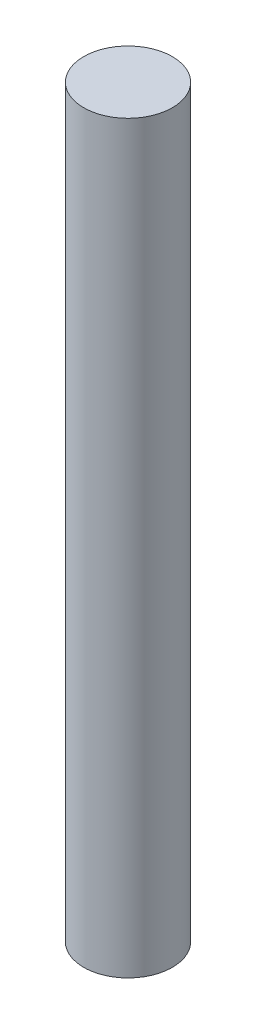
ISO-10303-21;
HEADER;
FILE_DESCRIPTION(('STEP AP214'),'2;1');
FILE_NAME('part.step','',(''),(''),'','','');
FILE_SCHEMA(('AUTOMOTIVE_DESIGN { 1 0 10303 214 1 1 1 1 }'));
ENDSEC;
DATA;
#1=APPLICATION_CONTEXT('core data for automotive mechanical design processes');
#2=APPLICATION_PROTOCOL_DEFINITION('international standard','automotive_design',2000,#1);
#3=PRODUCT_CONTEXT('',#1,'mechanical');
#4=PRODUCT('Part','Part','',(#3));
#5=PRODUCT_RELATED_PRODUCT_CATEGORY('part','',(#4));
#6=PRODUCT_DEFINITION_FORMATION('','',#4);
#7=PRODUCT_DEFINITION_CONTEXT('part definition',#1,'design');
#8=PRODUCT_DEFINITION('design','',#6,#7);
#9=PRODUCT_DEFINITION_SHAPE('','',#8);
#10=(LENGTH_UNIT() NAMED_UNIT(*) SI_UNIT(.MILLI.,.METRE.));
#11=(NAMED_UNIT(*) PLANE_ANGLE_UNIT() SI_UNIT($,.RADIAN.));
#12=(NAMED_UNIT(*) SI_UNIT($,.STERADIAN.) SOLID_ANGLE_UNIT());
#13=UNCERTAINTY_MEASURE_WITH_UNIT(LENGTH_MEASURE(1.E-05),#10,'distance_accuracy_value','');
#14=(GEOMETRIC_REPRESENTATION_CONTEXT(3) GLOBAL_UNCERTAINTY_ASSIGNED_CONTEXT((#13)) GLOBAL_UNIT_ASSIGNED_CONTEXT((#10,
#11,#12)) REPRESENTATION_CONTEXT('',''));
#15=CARTESIAN_POINT('',(0.,0.,0.));
#16=DIRECTION('',(0.,0.,1.));
#17=DIRECTION('',(1.,0.,0.));
#18=AXIS2_PLACEMENT_3D('',#15,#16,#17);
#19=CARTESIAN_POINT('',(0.,42.,0.));
#20=DIRECTION('',(0.,-1.,0.));
#21=DIRECTION('',(0.,0.,-1.));
#22=AXIS2_PLACEMENT_3D('',#19,#20,#21);
#23=CYLINDRICAL_SURFACE('',#22,2.5);
#24=CARTESIAN_POINT('',(0.,42.,0.));
#25=DIRECTION('',(0.,1.,0.));
#26=DIRECTION('',(0.,0.,1.));
#27=AXIS2_PLACEMENT_3D('',#24,#25,#26);
#28=CIRCLE('',#27,2.5);
#29=CARTESIAN_POINT('',(0.,42.,-2.5));
#30=VERTEX_POINT('',#29);
#31=EDGE_CURVE('E10',#30,#30,#28,.T.);
#32=CARTESIAN_POINT('',(0.,0.,0.));
#33=DIRECTION('',(0.,1.,0.));
#34=DIRECTION('',(0.,0.,1.));
#35=AXIS2_PLACEMENT_3D('',#32,#33,#34);
#36=CIRCLE('',#35,2.5);
#37=CARTESIAN_POINT('',(0.,0.,-2.5));
#38=VERTEX_POINT('',#37);
#39=EDGE_CURVE('E36',#38,#38,#36,.T.);
#40=CARTESIAN_POINT('',(0.,42.,-2.5));
#41=CARTESIAN_POINT('',(0.,41.5625,-2.5));
#42=CARTESIAN_POINT('',(0.,41.125,-2.5));
#43=CARTESIAN_POINT('',(0.,40.25,-2.5));
#44=CARTESIAN_POINT('',(0.,39.8125,-2.5));
#45=CARTESIAN_POINT('',(0.,38.9375,-2.5));
#46=CARTESIAN_POINT('',(0.,38.5,-2.5));
#47=CARTESIAN_POINT('',(0.,37.625,-2.5));
#48=CARTESIAN_POINT('',(0.,37.1875,-2.5));
#49=CARTESIAN_POINT('',(0.,36.3125,-2.5));
#50=CARTESIAN_POINT('',(0.,35.875,-2.5));
#51=CARTESIAN_POINT('',(0.,35.,-2.5));
#52=CARTESIAN_POINT('',(0.,34.5625,-2.5));
#53=CARTESIAN_POINT('',(0.,33.6875,-2.5));
#54=CARTESIAN_POINT('',(0.,33.25,-2.5));
#55=CARTESIAN_POINT('',(0.,32.375,-2.5));
#56=CARTESIAN_POINT('',(0.,31.9375,-2.5));
#57=CARTESIAN_POINT('',(0.,31.0625,-2.5));
#58=CARTESIAN_POINT('',(0.,30.625,-2.5));
#59=CARTESIAN_POINT('',(0.,29.75,-2.5));
#60=CARTESIAN_POINT('',(0.,29.3125,-2.5));
#61=CARTESIAN_POINT('',(0.,28.4375,-2.5));
#62=CARTESIAN_POINT('',(0.,28.,-2.5));
#63=CARTESIAN_POINT('',(0.,27.125,-2.5));
#64=CARTESIAN_POINT('',(0.,26.6875,-2.5));
#65=CARTESIAN_POINT('',(0.,25.8125,-2.5));
#66=CARTESIAN_POINT('',(0.,25.375,-2.5));
#67=CARTESIAN_POINT('',(0.,24.5,-2.5));
#68=CARTESIAN_POINT('',(0.,24.0625,-2.5));
#69=CARTESIAN_POINT('',(0.,23.1875,-2.5));
#70=CARTESIAN_POINT('',(0.,22.75,-2.5));
#71=CARTESIAN_POINT('',(0.,21.875,-2.5));
#72=CARTESIAN_POINT('',(0.,21.4375,-2.5));
#73=CARTESIAN_POINT('',(0.,20.5625,-2.5));
#74=CARTESIAN_POINT('',(0.,20.125,-2.5));
#75=CARTESIAN_POINT('',(0.,19.25,-2.5));
#76=CARTESIAN_POINT('',(0.,18.8125,-2.5));
#77=CARTESIAN_POINT('',(0.,17.9375,-2.5));
#78=CARTESIAN_POINT('',(0.,17.5,-2.5));
#79=CARTESIAN_POINT('',(0.,16.625,-2.5));
#80=CARTESIAN_POINT('',(0.,16.1875,-2.5));
#81=CARTESIAN_POINT('',(0.,15.3125,-2.5));
#82=CARTESIAN_POINT('',(0.,14.875,-2.5));
#83=CARTESIAN_POINT('',(0.,14.,-2.5));
#84=CARTESIAN_POINT('',(0.,13.5625,-2.5));
#85=CARTESIAN_POINT('',(0.,12.6875,-2.5));
#86=CARTESIAN_POINT('',(0.,12.25,-2.5));
#87=CARTESIAN_POINT('',(0.,11.375,-2.5));
#88=CARTESIAN_POINT('',(0.,10.9375,-2.5));
#89=CARTESIAN_POINT('',(0.,10.0625,-2.5));
#90=CARTESIAN_POINT('',(0.,9.625,-2.5));
#91=CARTESIAN_POINT('',(0.,8.75,-2.5));
#92=CARTESIAN_POINT('',(0.,8.3125,-2.5));
#93=CARTESIAN_POINT('',(0.,7.4375,-2.5));
#94=CARTESIAN_POINT('',(0.,7.,-2.5));
#95=CARTESIAN_POINT('',(0.,6.125,-2.5));
#96=CARTESIAN_POINT('',(0.,5.6875,-2.5));
#97=CARTESIAN_POINT('',(0.,4.8125,-2.5));
#98=CARTESIAN_POINT('',(0.,4.375,-2.5));
#99=CARTESIAN_POINT('',(0.,3.5,-2.5));
#100=CARTESIAN_POINT('',(0.,3.0625,-2.5));
#101=CARTESIAN_POINT('',(0.,2.1875,-2.5));
#102=CARTESIAN_POINT('',(0.,1.75,-2.5));
#103=CARTESIAN_POINT('',(0.,0.875000000000001,-2.5));
#104=CARTESIAN_POINT('',(0.,0.4375,-2.5));
#105=CARTESIAN_POINT('',(0.,0.,-2.5));
#106=B_SPLINE_CURVE_WITH_KNOTS('',3,(#40,#41,#42,#43,#44,#45,#46,#47,#48,#49,#50,#51,#52,#53,
#54,#55,#56,#57,#58,#59,#60,#61,#62,#63,#64,#65,#66,#67,#68,#69,#70,#71,#72,#73,#74,#75,#76,#77,
#78,#79,#80,#81,#82,#83,#84,#85,#86,#87,#88,#89,#90,#91,#92,#93,#94,#95,#96,#97,#98,#99,#100,
#101,#102,#103,#104,#105),.UNSPECIFIED.,.F.,.F.,(4,2,2,2,2,2,2,2,2,2,2,2,2,2,2,2,2,2,2,2,2,2,2,
2,2,2,2,2,2,2,2,2,4),(0.,1.3125,2.625,3.9375,5.25,6.56250000000001,7.875,9.1875,10.5,11.8125,
13.125,14.4375,15.75,17.0625,18.375,19.6875,21.,22.3125,23.625,24.9375,26.25,27.5625,28.875,
30.1875,31.5,32.8125,34.125,35.4375,36.75,38.0625,39.375,40.6875,42.),.UNSPECIFIED.);
#107=EDGE_CURVE('BSEAM33',#30,#38,#106,.T.);
#108=ORIENTED_EDGE('',*,*,#31,.F.);
#109=ORIENTED_EDGE('',*,*,#39,.T.);
#110=ORIENTED_EDGE('',*,*,#107,.T.);
#111=ORIENTED_EDGE('',*,*,#107,.F.);
#112=EDGE_LOOP('',(#108,#110,#109,#111));
#113=FACE_BOUND('',#112,.T.);
#114=ADVANCED_FACE('F33',(#113),#23,.T.);
#115=CARTESIAN_POINT('',(0.,42.,0.));
#116=DIRECTION('',(0.,1.,0.));
#117=DIRECTION('',(0.,0.,1.));
#118=AXIS2_PLACEMENT_3D('',#115,#116,#117);
#119=PLANE('',#118);
#120=ORIENTED_EDGE('',*,*,#31,.T.);
#121=EDGE_LOOP('',(#120));
#122=FACE_BOUND('',#121,.T.);
#123=ADVANCED_FACE('F48',(#122),#119,.T.);
#124=CARTESIAN_POINT('',(0.,0.,0.));
#125=DIRECTION('',(0.,1.,0.));
#126=DIRECTION('',(0.,0.,1.));
#127=AXIS2_PLACEMENT_3D('',#124,#125,#126);
#128=PLANE('',#127);
#129=ORIENTED_EDGE('',*,*,#39,.F.);
#130=EDGE_LOOP('',(#129));
#131=FACE_BOUND('',#130,.T.);
#132=ADVANCED_FACE('F46',(#131),#128,.F.);
#133=CLOSED_SHELL('',(#114,#123,#132));
#134=MANIFOLD_SOLID_BREP('B2',#133);
#135=ADVANCED_BREP_SHAPE_REPRESENTATION('',(#18,#134),#14);
#136=SHAPE_DEFINITION_REPRESENTATION(#9,#135);
ENDSEC;
END-ISO-10303-21;
